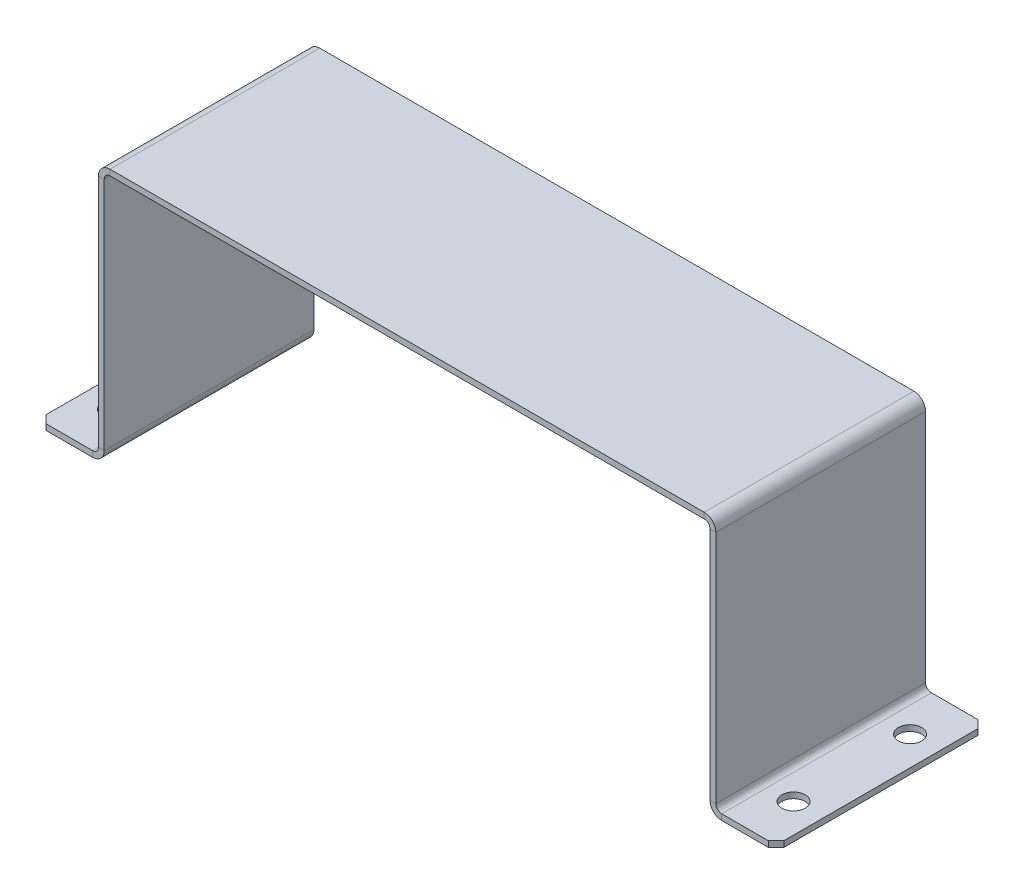
ISO-10303-21;
HEADER;
FILE_DESCRIPTION(('STEP AP214'),'2;1');
FILE_NAME('part.step','',(''),(''),'','','');
FILE_SCHEMA(('AUTOMOTIVE_DESIGN { 1 0 10303 214 1 1 1 1 }'));
ENDSEC;
DATA;
#1=APPLICATION_CONTEXT('core data for automotive mechanical design processes');
#2=APPLICATION_PROTOCOL_DEFINITION('international standard','automotive_design',2000,#1);
#3=PRODUCT_CONTEXT('',#1,'mechanical');
#4=PRODUCT('Part','Part','',(#3));
#5=PRODUCT_RELATED_PRODUCT_CATEGORY('part','',(#4));
#6=PRODUCT_DEFINITION_FORMATION('','',#4);
#7=PRODUCT_DEFINITION_CONTEXT('part definition',#1,'design');
#8=PRODUCT_DEFINITION('design','',#6,#7);
#9=PRODUCT_DEFINITION_SHAPE('','',#8);
#10=(LENGTH_UNIT() NAMED_UNIT(*) SI_UNIT(.MILLI.,.METRE.));
#11=(NAMED_UNIT(*) PLANE_ANGLE_UNIT() SI_UNIT($,.RADIAN.));
#12=(NAMED_UNIT(*) SI_UNIT($,.STERADIAN.) SOLID_ANGLE_UNIT());
#13=UNCERTAINTY_MEASURE_WITH_UNIT(LENGTH_MEASURE(1.E-05),#10,'distance_accuracy_value','');
#14=(GEOMETRIC_REPRESENTATION_CONTEXT(3) GLOBAL_UNCERTAINTY_ASSIGNED_CONTEXT((#13)) GLOBAL_UNIT_ASSIGNED_CONTEXT((#10,
#11,#12)) REPRESENTATION_CONTEXT('',''));
#15=CARTESIAN_POINT('',(0.,0.,0.));
#16=DIRECTION('',(0.,0.,1.));
#17=DIRECTION('',(1.,0.,0.));
#18=AXIS2_PLACEMENT_3D('',#15,#16,#17);
#19=CARTESIAN_POINT('',(-81.,-32.5,27.));
#20=DIRECTION('',(0.,0.,1.));
#21=DIRECTION('',(1.,0.,0.));
#22=AXIS2_PLACEMENT_3D('',#19,#20,#21);
#23=PLANE('',#22);
#24=DIRECTION('',(0.,1.,0.));
#25=VECTOR('',#24,1.);
#26=CARTESIAN_POINT('',(-81.,-32.5,27.));
#27=LINE('',#26,#25);
#28=CARTESIAN_POINT('',(-81.,-32.5,27.));
#29=VERTEX_POINT('',#28);
#30=CARTESIAN_POINT('',(-81.,-31.,27.));
#31=VERTEX_POINT('',#30);
#32=EDGE_CURVE('E200',#29,#31,#27,.T.);
#33=ORIENTED_EDGE('',*,*,#32,.F.);
#34=CARTESIAN_POINT('',(-81.,-29.5,27.));
#35=DIRECTION('',(0.,0.,-1.));
#36=DIRECTION('',(-1.,0.,0.));
#37=AXIS2_PLACEMENT_3D('',#34,#35,#36);
#38=CIRCLE('',#37,3.);
#39=CARTESIAN_POINT('',(-78.,-29.5,27.));
#40=VERTEX_POINT('',#39);
#41=EDGE_CURVE('E203',#40,#29,#38,.T.);
#42=ORIENTED_EDGE('',*,*,#41,.F.);
#43=DIRECTION('',(1.,0.,0.));
#44=VECTOR('',#43,1.);
#45=CARTESIAN_POINT('',(-79.5,-29.5,27.));
#46=LINE('',#45,#44);
#47=CARTESIAN_POINT('',(-79.5,-29.5,27.));
#48=VERTEX_POINT('',#47);
#49=EDGE_CURVE('E212',#48,#40,#46,.T.);
#50=ORIENTED_EDGE('',*,*,#49,.F.);
#51=CARTESIAN_POINT('',(-81.,-29.5,27.));
#52=DIRECTION('',(0.,0.,1.));
#53=DIRECTION('',(1.,0.,0.));
#54=AXIS2_PLACEMENT_3D('',#51,#52,#53);
#55=CIRCLE('',#54,1.5);
#56=EDGE_CURVE('E206',#48,#31,#55,.F.);
#57=ORIENTED_EDGE('',*,*,#56,.T.);
#58=EDGE_LOOP('',(#33,#42,#50,#57));
#59=FACE_BOUND('',#58,.T.);
#60=ADVANCED_FACE('F37',(#59),#23,.T.);
#61=CARTESIAN_POINT('',(-79.5,-29.5,27.));
#62=DIRECTION('',(0.,0.,1.));
#63=DIRECTION('',(1.,0.,0.));
#64=AXIS2_PLACEMENT_3D('',#61,#62,#63);
#65=PLANE('',#64);
#66=DIRECTION('',(1.,0.,0.));
#67=VECTOR('',#66,1.);
#68=CARTESIAN_POINT('',(-78.,-31.,27.));
#69=LINE('',#68,#67);
#70=CARTESIAN_POINT('',(-93.,-31.,27.));
#71=VERTEX_POINT('',#70);
#72=EDGE_CURVE('E233',#31,#71,#69,.F.);
#73=ORIENTED_EDGE('',*,*,#72,.T.);
#74=DIRECTION('',(0.,-1.,0.));
#75=VECTOR('',#74,1.);
#76=CARTESIAN_POINT('',(-93.,-29.5,27.));
#77=LINE('',#76,#75);
#78=CARTESIAN_POINT('',(-93.,-32.5,27.));
#79=VERTEX_POINT('',#78);
#80=EDGE_CURVE('E232',#71,#79,#77,.T.);
#81=ORIENTED_EDGE('',*,*,#80,.T.);
#82=DIRECTION('',(-1.,0.,0.));
#83=VECTOR('',#82,1.);
#84=CARTESIAN_POINT('',(-78.,-32.5,27.));
#85=LINE('',#84,#83);
#86=EDGE_CURVE('E220',#29,#79,#85,.T.);
#87=ORIENTED_EDGE('',*,*,#86,.F.);
#88=ORIENTED_EDGE('',*,*,#32,.T.);
#89=EDGE_LOOP('',(#73,#81,#87,#88));
#90=FACE_BOUND('',#89,.T.);
#91=ADVANCED_FACE('F230',(#90),#65,.T.);
#92=CARTESIAN_POINT('',(-78.,-29.5,-27.));
#93=DIRECTION('',(0.,0.,-1.));
#94=DIRECTION('',(-1.,0.,0.));
#95=AXIS2_PLACEMENT_3D('',#92,#93,#94);
#96=PLANE('',#95);
#97=DIRECTION('',(-1.,0.,0.));
#98=VECTOR('',#97,1.);
#99=CARTESIAN_POINT('',(-78.,-29.5,-27.));
#100=LINE('',#99,#98);
#101=CARTESIAN_POINT('',(-78.,-29.5,-27.));
#102=VERTEX_POINT('',#101);
#103=CARTESIAN_POINT('',(-79.5,-29.5,-27.));
#104=VERTEX_POINT('',#103);
#105=EDGE_CURVE('E412',#102,#104,#100,.T.);
#106=ORIENTED_EDGE('',*,*,#105,.F.);
#107=CARTESIAN_POINT('',(-81.,-29.5,-27.));
#108=DIRECTION('',(0.,0.,-1.));
#109=DIRECTION('',(-1.,0.,0.));
#110=AXIS2_PLACEMENT_3D('',#107,#108,#109);
#111=CIRCLE('',#110,3.);
#112=CARTESIAN_POINT('',(-81.,-32.5,-27.));
#113=VERTEX_POINT('',#112);
#114=EDGE_CURVE('E287',#102,#113,#111,.T.);
#115=ORIENTED_EDGE('',*,*,#114,.T.);
#116=DIRECTION('',(0.,-1.,0.));
#117=VECTOR('',#116,1.);
#118=CARTESIAN_POINT('',(-81.,-31.,-27.));
#119=LINE('',#118,#117);
#120=CARTESIAN_POINT('',(-81.,-31.,-27.));
#121=VERTEX_POINT('',#120);
#122=EDGE_CURVE('E410',#121,#113,#119,.T.);
#123=ORIENTED_EDGE('',*,*,#122,.F.);
#124=CARTESIAN_POINT('',(-81.,-29.5,-27.));
#125=DIRECTION('',(0.,0.,1.));
#126=DIRECTION('',(1.,0.,0.));
#127=AXIS2_PLACEMENT_3D('',#124,#125,#126);
#128=CIRCLE('',#127,1.5);
#129=EDGE_CURVE('E329',#104,#121,#128,.F.);
#130=ORIENTED_EDGE('',*,*,#129,.F.);
#131=EDGE_LOOP('',(#106,#115,#123,#130));
#132=FACE_BOUND('',#131,.T.);
#133=ADVANCED_FACE('F577',(#132),#96,.T.);
#134=CARTESIAN_POINT('',(-81.,-31.,-27.));
#135=DIRECTION('',(0.,0.,-1.));
#136=DIRECTION('',(-1.,0.,0.));
#137=AXIS2_PLACEMENT_3D('',#134,#135,#136);
#138=PLANE('',#137);
#139=DIRECTION('',(0.,-1.,0.));
#140=VECTOR('',#139,1.);
#141=CARTESIAN_POINT('',(-78.,-32.5,-27.));
#142=LINE('',#141,#140);
#143=CARTESIAN_POINT('',(-78.,31.,-27.));
#144=VERTEX_POINT('',#143);
#145=EDGE_CURVE('E289',#144,#102,#142,.T.);
#146=ORIENTED_EDGE('',*,*,#145,.T.);
#147=ORIENTED_EDGE('',*,*,#105,.T.);
#148=DIRECTION('',(0.,1.,0.));
#149=VECTOR('',#148,1.);
#150=CARTESIAN_POINT('',(-79.5,-32.5,-27.));
#151=LINE('',#150,#149);
#152=CARTESIAN_POINT('',(-79.5,31.,-27.));
#153=VERTEX_POINT('',#152);
#154=EDGE_CURVE('E326',#153,#104,#151,.F.);
#155=ORIENTED_EDGE('',*,*,#154,.F.);
#156=DIRECTION('',(1.,0.,0.));
#157=VECTOR('',#156,1.);
#158=CARTESIAN_POINT('',(-79.5,31.,-27.));
#159=LINE('',#158,#157);
#160=EDGE_CURVE('E402',#153,#144,#159,.T.);
#161=ORIENTED_EDGE('',*,*,#160,.T.);
#162=EDGE_LOOP('',(#146,#147,#155,#161));
#163=FACE_BOUND('',#162,.T.);
#164=ADVANCED_FACE('F614',(#163),#138,.T.);
#165=CARTESIAN_POINT('',(-78.,31.,27.));
#166=DIRECTION('',(0.,0.,1.));
#167=DIRECTION('',(1.,0.,0.));
#168=AXIS2_PLACEMENT_3D('',#165,#166,#167);
#169=PLANE('',#168);
#170=DIRECTION('',(-1.,0.,0.));
#171=VECTOR('',#170,1.);
#172=CARTESIAN_POINT('',(-78.,31.,27.));
#173=LINE('',#172,#171);
#174=CARTESIAN_POINT('',(-78.,31.,27.));
#175=VERTEX_POINT('',#174);
#176=CARTESIAN_POINT('',(-79.5,31.,27.));
#177=VERTEX_POINT('',#176);
#178=EDGE_CURVE('E408',#175,#177,#173,.T.);
#179=ORIENTED_EDGE('',*,*,#178,.F.);
#180=CARTESIAN_POINT('',(-76.5,31.,27.));
#181=DIRECTION('',(0.,0.,1.));
#182=DIRECTION('',(1.,0.,0.));
#183=AXIS2_PLACEMENT_3D('',#180,#181,#182);
#184=CIRCLE('',#183,1.5);
#185=CARTESIAN_POINT('',(-76.5,32.5,27.));
#186=VERTEX_POINT('',#185);
#187=EDGE_CURVE('E240',#186,#175,#184,.T.);
#188=ORIENTED_EDGE('',*,*,#187,.F.);
#189=DIRECTION('',(0.,-1.,0.));
#190=VECTOR('',#189,1.);
#191=CARTESIAN_POINT('',(-76.5,34.,27.));
#192=LINE('',#191,#190);
#193=CARTESIAN_POINT('',(-76.5,34.,27.));
#194=VERTEX_POINT('',#193);
#195=EDGE_CURVE('E406',#194,#186,#192,.T.);
#196=ORIENTED_EDGE('',*,*,#195,.F.);
#197=CARTESIAN_POINT('',(-76.5,31.,27.));
#198=DIRECTION('',(0.,0.,1.));
#199=DIRECTION('',(1.,0.,0.));
#200=AXIS2_PLACEMENT_3D('',#197,#198,#199);
#201=CIRCLE('',#200,3.);
#202=EDGE_CURVE('E274',#194,#177,#201,.T.);
#203=ORIENTED_EDGE('',*,*,#202,.T.);
#204=EDGE_LOOP('',(#179,#188,#196,#203));
#205=FACE_BOUND('',#204,.T.);
#206=ADVANCED_FACE('F507',(#205),#169,.T.);
#207=CARTESIAN_POINT('',(-76.5,34.,27.));
#208=DIRECTION('',(0.,0.,1.));
#209=DIRECTION('',(1.,0.,0.));
#210=AXIS2_PLACEMENT_3D('',#207,#208,#209);
#211=PLANE('',#210);
#212=DIRECTION('',(0.,-1.,0.));
#213=VECTOR('',#212,1.);
#214=CARTESIAN_POINT('',(-78.,-32.5,27.));
#215=LINE('',#214,#213);
#216=EDGE_CURVE('E238',#175,#40,#215,.T.);
#217=ORIENTED_EDGE('',*,*,#216,.F.);
#218=ORIENTED_EDGE('',*,*,#178,.T.);
#219=DIRECTION('',(0.,1.,0.));
#220=VECTOR('',#219,1.);
#221=CARTESIAN_POINT('',(-79.5,-32.5,27.));
#222=LINE('',#221,#220);
#223=EDGE_CURVE('E277',#177,#48,#222,.F.);
#224=ORIENTED_EDGE('',*,*,#223,.T.);
#225=ORIENTED_EDGE('',*,*,#49,.T.);
#226=EDGE_LOOP('',(#217,#218,#224,#225));
#227=FACE_BOUND('',#226,.T.);
#228=ADVANCED_FACE('F516',(#227),#211,.T.);
#229=CARTESIAN_POINT('',(-76.5,32.5,-27.));
#230=DIRECTION('',(0.,0.,-1.));
#231=DIRECTION('',(-1.,0.,0.));
#232=AXIS2_PLACEMENT_3D('',#229,#230,#231);
#233=PLANE('',#232);
#234=DIRECTION('',(0.,1.,0.));
#235=VECTOR('',#234,1.);
#236=CARTESIAN_POINT('',(-76.5,32.5,-27.));
#237=LINE('',#236,#235);
#238=CARTESIAN_POINT('',(-76.5,32.5,-27.));
#239=VERTEX_POINT('',#238);
#240=CARTESIAN_POINT('',(-76.5,34.,-27.));
#241=VERTEX_POINT('',#240);
#242=EDGE_CURVE('E404',#239,#241,#237,.T.);
#243=ORIENTED_EDGE('',*,*,#242,.F.);
#244=CARTESIAN_POINT('',(-76.5,31.,-27.));
#245=DIRECTION('',(0.,0.,1.));
#246=DIRECTION('',(1.,0.,0.));
#247=AXIS2_PLACEMENT_3D('',#244,#245,#246);
#248=CIRCLE('',#247,1.5);
#249=EDGE_CURVE('E292',#239,#144,#248,.T.);
#250=ORIENTED_EDGE('',*,*,#249,.T.);
#251=ORIENTED_EDGE('',*,*,#160,.F.);
#252=CARTESIAN_POINT('',(-76.5,31.,-27.));
#253=DIRECTION('',(0.,0.,1.));
#254=DIRECTION('',(1.,0.,0.));
#255=AXIS2_PLACEMENT_3D('',#252,#253,#254);
#256=CIRCLE('',#255,3.);
#257=EDGE_CURVE('E323',#241,#153,#256,.T.);
#258=ORIENTED_EDGE('',*,*,#257,.F.);
#259=EDGE_LOOP('',(#243,#250,#251,#258));
#260=FACE_BOUND('',#259,.T.);
#261=ADVANCED_FACE('F656',(#260),#233,.T.);
#262=CARTESIAN_POINT('',(-79.5,31.,-27.));
#263=DIRECTION('',(0.,0.,-1.));
#264=DIRECTION('',(-1.,0.,0.));
#265=AXIS2_PLACEMENT_3D('',#262,#263,#264);
#266=PLANE('',#265);
#267=DIRECTION('',(-1.,0.,0.));
#268=VECTOR('',#267,1.);
#269=CARTESIAN_POINT('',(-78.,32.5,-27.));
#270=LINE('',#269,#268);
#271=CARTESIAN_POINT('',(76.5,32.5,-27.));
#272=VERTEX_POINT('',#271);
#273=EDGE_CURVE('E295',#272,#239,#270,.T.);
#274=ORIENTED_EDGE('',*,*,#273,.T.);
#275=ORIENTED_EDGE('',*,*,#242,.T.);
#276=DIRECTION('',(1.,0.,0.));
#277=VECTOR('',#276,1.);
#278=CARTESIAN_POINT('',(-78.,34.,-27.));
#279=LINE('',#278,#277);
#280=CARTESIAN_POINT('',(76.5,34.,-27.));
#281=VERTEX_POINT('',#280);
#282=EDGE_CURVE('E320',#281,#241,#279,.F.);
#283=ORIENTED_EDGE('',*,*,#282,.F.);
#284=DIRECTION('',(0.,-1.,0.));
#285=VECTOR('',#284,1.);
#286=CARTESIAN_POINT('',(76.5,34.,-27.));
#287=LINE('',#286,#285);
#288=EDGE_CURVE('E394',#281,#272,#287,.T.);
#289=ORIENTED_EDGE('',*,*,#288,.T.);
#290=EDGE_LOOP('',(#274,#275,#283,#289));
#291=FACE_BOUND('',#290,.T.);
#292=ADVANCED_FACE('F653',(#291),#266,.T.);
#293=CARTESIAN_POINT('',(76.5,32.5,27.));
#294=DIRECTION('',(0.,0.,1.));
#295=DIRECTION('',(1.,0.,0.));
#296=AXIS2_PLACEMENT_3D('',#293,#294,#295);
#297=PLANE('',#296);
#298=DIRECTION('',(0.,1.,0.));
#299=VECTOR('',#298,1.);
#300=CARTESIAN_POINT('',(76.5,32.5,27.));
#301=LINE('',#300,#299);
#302=CARTESIAN_POINT('',(76.5,32.5,27.));
#303=VERTEX_POINT('',#302);
#304=CARTESIAN_POINT('',(76.5,34.,27.));
#305=VERTEX_POINT('',#304);
#306=EDGE_CURVE('E400',#303,#305,#301,.T.);
#307=ORIENTED_EDGE('',*,*,#306,.F.);
#308=CARTESIAN_POINT('',(76.5,31.,27.));
#309=DIRECTION('',(0.,0.,1.));
#310=DIRECTION('',(1.,0.,0.));
#311=AXIS2_PLACEMENT_3D('',#308,#309,#310);
#312=CIRCLE('',#311,1.5);
#313=CARTESIAN_POINT('',(78.,31.,27.));
#314=VERTEX_POINT('',#313);
#315=EDGE_CURVE('E249',#314,#303,#312,.T.);
#316=ORIENTED_EDGE('',*,*,#315,.F.);
#317=DIRECTION('',(-1.,0.,0.));
#318=VECTOR('',#317,1.);
#319=CARTESIAN_POINT('',(79.5,31.,27.));
#320=LINE('',#319,#318);
#321=CARTESIAN_POINT('',(79.5,31.,27.));
#322=VERTEX_POINT('',#321);
#323=EDGE_CURVE('E398',#322,#314,#320,.T.);
#324=ORIENTED_EDGE('',*,*,#323,.F.);
#325=CARTESIAN_POINT('',(76.5,31.,27.));
#326=DIRECTION('',(0.,0.,1.));
#327=DIRECTION('',(1.,0.,0.));
#328=AXIS2_PLACEMENT_3D('',#325,#326,#327);
#329=CIRCLE('',#328,3.);
#330=EDGE_CURVE('E268',#322,#305,#329,.T.);
#331=ORIENTED_EDGE('',*,*,#330,.T.);
#332=EDGE_LOOP('',(#307,#316,#324,#331));
#333=FACE_BOUND('',#332,.T.);
#334=ADVANCED_FACE('F489',(#333),#297,.T.);
#335=CARTESIAN_POINT('',(79.5,31.,27.));
#336=DIRECTION('',(0.,0.,1.));
#337=DIRECTION('',(1.,0.,0.));
#338=AXIS2_PLACEMENT_3D('',#335,#336,#337);
#339=PLANE('',#338);
#340=DIRECTION('',(-1.,0.,0.));
#341=VECTOR('',#340,1.);
#342=CARTESIAN_POINT('',(-78.,32.5,27.));
#343=LINE('',#342,#341);
#344=EDGE_CURVE('E246',#303,#186,#343,.T.);
#345=ORIENTED_EDGE('',*,*,#344,.F.);
#346=ORIENTED_EDGE('',*,*,#306,.T.);
#347=DIRECTION('',(1.,0.,0.));
#348=VECTOR('',#347,1.);
#349=CARTESIAN_POINT('',(-78.,34.,27.));
#350=LINE('',#349,#348);
#351=EDGE_CURVE('E271',#305,#194,#350,.F.);
#352=ORIENTED_EDGE('',*,*,#351,.T.);
#353=ORIENTED_EDGE('',*,*,#195,.T.);
#354=EDGE_LOOP('',(#345,#346,#352,#353));
#355=FACE_BOUND('',#354,.T.);
#356=ADVANCED_FACE('F498',(#355),#339,.T.);
#357=CARTESIAN_POINT('',(78.,31.,-27.));
#358=DIRECTION('',(0.,0.,-1.));
#359=DIRECTION('',(-1.,0.,0.));
#360=AXIS2_PLACEMENT_3D('',#357,#358,#359);
#361=PLANE('',#360);
#362=DIRECTION('',(1.,0.,0.));
#363=VECTOR('',#362,1.);
#364=CARTESIAN_POINT('',(78.,31.,-27.));
#365=LINE('',#364,#363);
#366=CARTESIAN_POINT('',(78.,31.,-27.));
#367=VERTEX_POINT('',#366);
#368=CARTESIAN_POINT('',(79.5,31.,-27.));
#369=VERTEX_POINT('',#368);
#370=EDGE_CURVE('E396',#367,#369,#365,.T.);
#371=ORIENTED_EDGE('',*,*,#370,.F.);
#372=CARTESIAN_POINT('',(76.5,31.,-27.));
#373=DIRECTION('',(0.,0.,1.));
#374=DIRECTION('',(1.,0.,0.));
#375=AXIS2_PLACEMENT_3D('',#372,#373,#374);
#376=CIRCLE('',#375,1.5);
#377=EDGE_CURVE('E298',#367,#272,#376,.T.);
#378=ORIENTED_EDGE('',*,*,#377,.T.);
#379=ORIENTED_EDGE('',*,*,#288,.F.);
#380=CARTESIAN_POINT('',(76.5,31.,-27.));
#381=DIRECTION('',(0.,0.,1.));
#382=DIRECTION('',(1.,0.,0.));
#383=AXIS2_PLACEMENT_3D('',#380,#381,#382);
#384=CIRCLE('',#383,3.);
#385=EDGE_CURVE('E317',#369,#281,#384,.T.);
#386=ORIENTED_EDGE('',*,*,#385,.F.);
#387=EDGE_LOOP('',(#371,#378,#379,#386));
#388=FACE_BOUND('',#387,.T.);
#389=ADVANCED_FACE('F644',(#388),#361,.T.);
#390=CARTESIAN_POINT('',(76.5,34.,-27.));
#391=DIRECTION('',(0.,0.,-1.));
#392=DIRECTION('',(-1.,0.,0.));
#393=AXIS2_PLACEMENT_3D('',#390,#391,#392);
#394=PLANE('',#393);
#395=DIRECTION('',(0.,1.,0.));
#396=VECTOR('',#395,1.);
#397=CARTESIAN_POINT('',(78.,-32.5,-27.));
#398=LINE('',#397,#396);
#399=CARTESIAN_POINT('',(78.,-29.5,-27.));
#400=VERTEX_POINT('',#399);
#401=EDGE_CURVE('E301',#400,#367,#398,.T.);
#402=ORIENTED_EDGE('',*,*,#401,.T.);
#403=ORIENTED_EDGE('',*,*,#370,.T.);
#404=DIRECTION('',(0.,1.,0.));
#405=VECTOR('',#404,1.);
#406=CARTESIAN_POINT('',(79.5,-32.5,-27.));
#407=LINE('',#406,#405);
#408=CARTESIAN_POINT('',(79.5,-29.5,-27.));
#409=VERTEX_POINT('',#408);
#410=EDGE_CURVE('E314',#409,#369,#407,.T.);
#411=ORIENTED_EDGE('',*,*,#410,.F.);
#412=DIRECTION('',(-1.,0.,0.));
#413=VECTOR('',#412,1.);
#414=CARTESIAN_POINT('',(79.5,-29.5,-27.));
#415=LINE('',#414,#413);
#416=EDGE_CURVE('E384',#409,#400,#415,.T.);
#417=ORIENTED_EDGE('',*,*,#416,.T.);
#418=EDGE_LOOP('',(#402,#403,#411,#417));
#419=FACE_BOUND('',#418,.T.);
#420=ADVANCED_FACE('F641',(#419),#394,.T.);
#421=CARTESIAN_POINT('',(78.,-29.5,27.));
#422=DIRECTION('',(0.,0.,1.));
#423=DIRECTION('',(1.,0.,0.));
#424=AXIS2_PLACEMENT_3D('',#421,#422,#423);
#425=PLANE('',#424);
#426=DIRECTION('',(1.,0.,0.));
#427=VECTOR('',#426,1.);
#428=CARTESIAN_POINT('',(78.,-29.5,27.));
#429=LINE('',#428,#427);
#430=CARTESIAN_POINT('',(78.,-29.5,27.));
#431=VERTEX_POINT('',#430);
#432=CARTESIAN_POINT('',(79.5,-29.5,27.));
#433=VERTEX_POINT('',#432);
#434=EDGE_CURVE('E392',#431,#433,#429,.T.);
#435=ORIENTED_EDGE('',*,*,#434,.F.);
#436=CARTESIAN_POINT('',(81.,-29.5,27.));
#437=DIRECTION('',(0.,0.,-1.));
#438=DIRECTION('',(-1.,0.,0.));
#439=AXIS2_PLACEMENT_3D('',#436,#437,#438);
#440=CIRCLE('',#439,3.);
#441=CARTESIAN_POINT('',(81.,-32.5,27.));
#442=VERTEX_POINT('',#441);
#443=EDGE_CURVE('E255',#442,#431,#440,.T.);
#444=ORIENTED_EDGE('',*,*,#443,.F.);
#445=DIRECTION('',(0.,-1.,0.));
#446=VECTOR('',#445,1.);
#447=CARTESIAN_POINT('',(81.,-31.,27.));
#448=LINE('',#447,#446);
#449=CARTESIAN_POINT('',(81.,-31.,27.));
#450=VERTEX_POINT('',#449);
#451=EDGE_CURVE('E389',#450,#442,#448,.T.);
#452=ORIENTED_EDGE('',*,*,#451,.F.);
#453=CARTESIAN_POINT('',(81.,-29.5,27.));
#454=DIRECTION('',(0.,0.,1.));
#455=DIRECTION('',(1.,0.,0.));
#456=AXIS2_PLACEMENT_3D('',#453,#454,#455);
#457=CIRCLE('',#456,1.5);
#458=EDGE_CURVE('E262',#450,#433,#457,.F.);
#459=ORIENTED_EDGE('',*,*,#458,.T.);
#460=EDGE_LOOP('',(#435,#444,#452,#459));
#461=FACE_BOUND('',#460,.T.);
#462=ADVANCED_FACE('F471',(#461),#425,.T.);
#463=CARTESIAN_POINT('',(81.,-31.,27.));
#464=DIRECTION('',(0.,0.,1.));
#465=DIRECTION('',(1.,0.,0.));
#466=AXIS2_PLACEMENT_3D('',#463,#464,#465);
#467=PLANE('',#466);
#468=DIRECTION('',(0.,1.,0.));
#469=VECTOR('',#468,1.);
#470=CARTESIAN_POINT('',(78.,-32.5,27.));
#471=LINE('',#470,#469);
#472=EDGE_CURVE('E252',#431,#314,#471,.T.);
#473=ORIENTED_EDGE('',*,*,#472,.F.);
#474=ORIENTED_EDGE('',*,*,#434,.T.);
#475=DIRECTION('',(0.,1.,0.));
#476=VECTOR('',#475,1.);
#477=CARTESIAN_POINT('',(79.5,-32.5,27.));
#478=LINE('',#477,#476);
#479=EDGE_CURVE('E265',#433,#322,#478,.T.);
#480=ORIENTED_EDGE('',*,*,#479,.T.);
#481=ORIENTED_EDGE('',*,*,#323,.T.);
#482=EDGE_LOOP('',(#473,#474,#480,#481));
#483=FACE_BOUND('',#482,.T.);
#484=ADVANCED_FACE('F480',(#483),#467,.T.);
#485=CARTESIAN_POINT('',(81.,-32.5,-27.));
#486=DIRECTION('',(0.,0.,-1.));
#487=DIRECTION('',(-1.,0.,0.));
#488=AXIS2_PLACEMENT_3D('',#485,#486,#487);
#489=PLANE('',#488);
#490=DIRECTION('',(0.,1.,0.));
#491=VECTOR('',#490,1.);
#492=CARTESIAN_POINT('',(81.,-32.5,-27.));
#493=LINE('',#492,#491);
#494=CARTESIAN_POINT('',(81.,-32.5,-27.));
#495=VERTEX_POINT('',#494);
#496=CARTESIAN_POINT('',(81.,-31.,-27.));
#497=VERTEX_POINT('',#496);
#498=EDGE_CURVE('E386',#495,#497,#493,.T.);
#499=ORIENTED_EDGE('',*,*,#498,.F.);
#500=CARTESIAN_POINT('',(81.,-29.5,-27.));
#501=DIRECTION('',(0.,0.,-1.));
#502=DIRECTION('',(-1.,0.,0.));
#503=AXIS2_PLACEMENT_3D('',#500,#501,#502);
#504=CIRCLE('',#503,3.);
#505=EDGE_CURVE('E304',#495,#400,#504,.T.);
#506=ORIENTED_EDGE('',*,*,#505,.T.);
#507=ORIENTED_EDGE('',*,*,#416,.F.);
#508=CARTESIAN_POINT('',(81.,-29.5,-27.));
#509=DIRECTION('',(0.,0.,1.));
#510=DIRECTION('',(1.,0.,0.));
#511=AXIS2_PLACEMENT_3D('',#508,#509,#510);
#512=CIRCLE('',#511,1.5);
#513=EDGE_CURVE('E311',#497,#409,#512,.F.);
#514=ORIENTED_EDGE('',*,*,#513,.F.);
#515=EDGE_LOOP('',(#499,#506,#507,#514));
#516=FACE_BOUND('',#515,.T.);
#517=ADVANCED_FACE('F633',(#516),#489,.T.);
#518=CARTESIAN_POINT('',(79.5,-29.5,-27.));
#519=DIRECTION('',(0.,0.,-1.));
#520=DIRECTION('',(-1.,0.,0.));
#521=AXIS2_PLACEMENT_3D('',#518,#519,#520);
#522=PLANE('',#521);
#523=DIRECTION('',(1.,0.,0.));
#524=VECTOR('',#523,1.);
#525=CARTESIAN_POINT('',(78.,-31.,-27.));
#526=LINE('',#525,#524);
#527=CARTESIAN_POINT('',(93.,-31.,-27.));
#528=VERTEX_POINT('',#527);
#529=EDGE_CURVE('E309',#528,#497,#526,.F.);
#530=ORIENTED_EDGE('',*,*,#529,.F.);
#531=DIRECTION('',(0.,-1.,0.));
#532=VECTOR('',#531,1.);
#533=CARTESIAN_POINT('',(93.,-29.5,-27.));
#534=LINE('',#533,#532);
#535=CARTESIAN_POINT('',(93.,-32.5,-27.));
#536=VERTEX_POINT('',#535);
#537=EDGE_CURVE('E11',#528,#536,#534,.T.);
#538=ORIENTED_EDGE('',*,*,#537,.T.);
#539=DIRECTION('',(-1.,0.,0.));
#540=VECTOR('',#539,1.);
#541=CARTESIAN_POINT('',(78.,-32.5,-27.));
#542=LINE('',#541,#540);
#543=EDGE_CURVE('E307',#536,#495,#542,.T.);
#544=ORIENTED_EDGE('',*,*,#543,.T.);
#545=ORIENTED_EDGE('',*,*,#498,.T.);
#546=EDGE_LOOP('',(#530,#538,#544,#545));
#547=FACE_BOUND('',#546,.T.);
#548=ADVANCED_FACE('F552',(#547),#522,.T.);
#549=CARTESIAN_POINT('',(-78.,-31.,27.));
#550=DIRECTION('',(0.,-1.,0.));
#551=DIRECTION('',(0.,0.,-1.));
#552=AXIS2_PLACEMENT_3D('',#549,#550,#551);
#553=PLANE('',#552);
#554=CARTESIAN_POINT('',(-87.5,-31.,-15.));
#555=DIRECTION('',(0.,1.,0.));
#556=DIRECTION('',(0.,0.,-1.));
#557=AXIS2_PLACEMENT_3D('',#554,#555,#556);
#558=CIRCLE('',#557,3.00000000000001);
#559=CARTESIAN_POINT('',(-87.5,-31.,-18.));
#560=VERTEX_POINT('',#559);
#561=EDGE_CURVE('E422',#560,#560,#558,.T.);
#562=ORIENTED_EDGE('',*,*,#561,.F.);
#563=EDGE_LOOP('',(#562));
#564=FACE_BOUND('',#563,.T.);
#565=CARTESIAN_POINT('',(-87.5,-31.,15.));
#566=DIRECTION('',(0.,1.,0.));
#567=DIRECTION('',(0.,0.,1.));
#568=AXIS2_PLACEMENT_3D('',#565,#566,#567);
#569=CIRCLE('',#568,3.00000000000001);
#570=CARTESIAN_POINT('',(-87.5,-31.,18.));
#571=VERTEX_POINT('',#570);
#572=EDGE_CURVE('E417',#571,#571,#569,.T.);
#573=ORIENTED_EDGE('',*,*,#572,.F.);
#574=EDGE_LOOP('',(#573));
#575=FACE_BOUND('',#574,.T.);
#576=DIRECTION('',(0.,0.,-1.));
#577=VECTOR('',#576,1.);
#578=CARTESIAN_POINT('',(-95.,-31.,27.));
#579=LINE('',#578,#577);
#580=CARTESIAN_POINT('',(-95.,-31.,25.));
#581=VERTEX_POINT('',#580);
#582=CARTESIAN_POINT('',(-95.,-31.,-25.));
#583=VERTEX_POINT('',#582);
#584=EDGE_CURVE('E381',#581,#583,#579,.T.);
#585=ORIENTED_EDGE('',*,*,#584,.F.);
#586=DIRECTION('',(-0.707106781186552,0.,-0.707106781186543));
#587=VECTOR('',#586,1.);
#588=CARTESIAN_POINT('',(-95.,-31.,25.));
#589=LINE('',#588,#587);
#590=EDGE_CURVE('E429',#581,#71,#589,.F.);
#591=ORIENTED_EDGE('',*,*,#590,.T.);
#592=ORIENTED_EDGE('',*,*,#72,.F.);
#593=DIRECTION('',(0.,0.,-1.));
#594=VECTOR('',#593,1.);
#595=CARTESIAN_POINT('',(-81.,-31.,27.));
#596=LINE('',#595,#594);
#597=EDGE_CURVE('E281',#31,#121,#596,.T.);
#598=ORIENTED_EDGE('',*,*,#597,.T.);
#599=DIRECTION('',(1.,0.,0.));
#600=VECTOR('',#599,1.);
#601=CARTESIAN_POINT('',(-78.,-31.,-27.));
#602=LINE('',#601,#600);
#603=CARTESIAN_POINT('',(-93.,-31.,-27.));
#604=VERTEX_POINT('',#603);
#605=EDGE_CURVE('E282',#121,#604,#602,.F.);
#606=ORIENTED_EDGE('',*,*,#605,.T.);
#607=DIRECTION('',(0.707106781186548,0.,-0.707106781186548));
#608=VECTOR('',#607,1.);
#609=CARTESIAN_POINT('',(-93.,-31.,-27.));
#610=LINE('',#609,#608);
#611=EDGE_CURVE('E427',#604,#583,#610,.F.);
#612=ORIENTED_EDGE('',*,*,#611,.T.);
#613=EDGE_LOOP('',(#585,#591,#592,#598,#606,#612));
#614=FACE_BOUND('',#613,.T.);
#615=ADVANCED_FACE('F529',(#564,#575,#614),#553,.F.);
#616=CARTESIAN_POINT('',(-95.,-32.5,27.));
#617=DIRECTION('',(-1.,0.,0.));
#618=DIRECTION('',(0.,0.,1.));
#619=AXIS2_PLACEMENT_3D('',#616,#617,#618);
#620=PLANE('',#619);
#621=DIRECTION('',(0.,0.,-1.));
#622=VECTOR('',#621,1.);
#623=CARTESIAN_POINT('',(-95.,-32.5,27.));
#624=LINE('',#623,#622);
#625=CARTESIAN_POINT('',(-95.,-32.5,25.));
#626=VERTEX_POINT('',#625);
#627=CARTESIAN_POINT('',(-95.,-32.5,-25.));
#628=VERTEX_POINT('',#627);
#629=EDGE_CURVE('E227',#626,#628,#624,.T.);
#630=ORIENTED_EDGE('',*,*,#629,.F.);
#631=DIRECTION('',(0.,1.,0.));
#632=VECTOR('',#631,1.);
#633=CARTESIAN_POINT('',(-95.,-32.5,25.));
#634=LINE('',#633,#632);
#635=EDGE_CURVE('E424',#626,#581,#634,.T.);
#636=ORIENTED_EDGE('',*,*,#635,.T.);
#637=ORIENTED_EDGE('',*,*,#584,.T.);
#638=DIRECTION('',(0.,-1.,0.));
#639=VECTOR('',#638,1.);
#640=CARTESIAN_POINT('',(-95.,-32.5,-25.));
#641=LINE('',#640,#639);
#642=EDGE_CURVE('E211',#583,#628,#641,.T.);
#643=ORIENTED_EDGE('',*,*,#642,.T.);
#644=EDGE_LOOP('',(#630,#636,#637,#643));
#645=FACE_BOUND('',#644,.T.);
#646=ADVANCED_FACE('F551',(#645),#620,.T.);
#647=CARTESIAN_POINT('',(-78.,-32.5,27.));
#648=DIRECTION('',(0.,-1.,0.));
#649=DIRECTION('',(0.,0.,-1.));
#650=AXIS2_PLACEMENT_3D('',#647,#648,#649);
#651=PLANE('',#650);
#652=CARTESIAN_POINT('',(-87.5,-32.5,-15.));
#653=DIRECTION('',(0.,-1.,0.));
#654=DIRECTION('',(0.,0.,-1.));
#655=AXIS2_PLACEMENT_3D('',#652,#653,#654);
#656=CIRCLE('',#655,3.00000000000001);
#657=CARTESIAN_POINT('',(-87.5,-32.5,-18.));
#658=VERTEX_POINT('',#657);
#659=EDGE_CURVE('E418',#658,#658,#656,.T.);
#660=ORIENTED_EDGE('',*,*,#659,.F.);
#661=EDGE_LOOP('',(#660));
#662=FACE_BOUND('',#661,.T.);
#663=CARTESIAN_POINT('',(-87.5,-32.5,15.));
#664=DIRECTION('',(0.,-1.,0.));
#665=DIRECTION('',(0.,0.,-1.));
#666=AXIS2_PLACEMENT_3D('',#663,#664,#665);
#667=CIRCLE('',#666,3.00000000000001);
#668=CARTESIAN_POINT('',(-87.5,-32.5,12.));
#669=VERTEX_POINT('',#668);
#670=EDGE_CURVE('E285',#669,#669,#667,.T.);
#671=ORIENTED_EDGE('',*,*,#670,.F.);
#672=EDGE_LOOP('',(#671));
#673=FACE_BOUND('',#672,.T.);
#674=ORIENTED_EDGE('',*,*,#86,.T.);
#675=DIRECTION('',(0.707106781186552,0.,0.707106781186543));
#676=VECTOR('',#675,1.);
#677=CARTESIAN_POINT('',(-85.4999999999999,-32.5,34.5));
#678=LINE('',#677,#676);
#679=EDGE_CURVE('E434',#79,#626,#678,.F.);
#680=ORIENTED_EDGE('',*,*,#679,.T.);
#681=ORIENTED_EDGE('',*,*,#629,.T.);
#682=DIRECTION('',(-0.707106781186548,0.,0.707106781186548));
#683=VECTOR('',#682,1.);
#684=CARTESIAN_POINT('',(-112.5,-32.5,-7.5));
#685=LINE('',#684,#683);
#686=CARTESIAN_POINT('',(-93.,-32.5,-27.));
#687=VERTEX_POINT('',#686);
#688=EDGE_CURVE('E432',#628,#687,#685,.F.);
#689=ORIENTED_EDGE('',*,*,#688,.T.);
#690=DIRECTION('',(-1.,0.,0.));
#691=VECTOR('',#690,1.);
#692=CARTESIAN_POINT('',(-78.,-32.5,-27.));
#693=LINE('',#692,#691);
#694=EDGE_CURVE('E223',#113,#687,#693,.T.);
#695=ORIENTED_EDGE('',*,*,#694,.F.);
#696=DIRECTION('',(0.,0.,-1.));
#697=VECTOR('',#696,1.);
#698=CARTESIAN_POINT('',(-81.,-32.5,27.));
#699=LINE('',#698,#697);
#700=EDGE_CURVE('E218',#29,#113,#699,.T.);
#701=ORIENTED_EDGE('',*,*,#700,.F.);
#702=EDGE_LOOP('',(#674,#680,#681,#689,#695,#701));
#703=FACE_BOUND('',#702,.T.);
#704=ADVANCED_FACE('F219',(#662,#673,#703),#651,.T.);
#705=CARTESIAN_POINT('',(-81.,-29.5,27.));
#706=DIRECTION('',(0.,0.,-1.));
#707=DIRECTION('',(-1.,0.,0.));
#708=AXIS2_PLACEMENT_3D('',#705,#706,#707);
#709=CYLINDRICAL_SURFACE('',#708,3.);
#710=ORIENTED_EDGE('',*,*,#114,.F.);
#711=DIRECTION('',(0.,0.,-1.));
#712=VECTOR('',#711,1.);
#713=CARTESIAN_POINT('',(-78.,-29.5,27.));
#714=LINE('',#713,#712);
#715=EDGE_CURVE('E228',#40,#102,#714,.T.);
#716=ORIENTED_EDGE('',*,*,#715,.F.);
#717=ORIENTED_EDGE('',*,*,#41,.T.);
#718=ORIENTED_EDGE('',*,*,#700,.T.);
#719=EDGE_LOOP('',(#710,#716,#717,#718));
#720=FACE_BOUND('',#719,.T.);
#721=ADVANCED_FACE('F236',(#720),#709,.T.);
#722=CARTESIAN_POINT('',(-78.,-32.5,27.));
#723=DIRECTION('',(1.,0.,0.));
#724=DIRECTION('',(0.,0.,-1.));
#725=AXIS2_PLACEMENT_3D('',#722,#723,#724);
#726=PLANE('',#725);
#727=ORIENTED_EDGE('',*,*,#145,.F.);
#728=DIRECTION('',(0.,0.,-1.));
#729=VECTOR('',#728,1.);
#730=CARTESIAN_POINT('',(-78.,31.,27.));
#731=LINE('',#730,#729);
#732=EDGE_CURVE('E375',#175,#144,#731,.T.);
#733=ORIENTED_EDGE('',*,*,#732,.F.);
#734=ORIENTED_EDGE('',*,*,#216,.T.);
#735=ORIENTED_EDGE('',*,*,#715,.T.);
#736=EDGE_LOOP('',(#727,#733,#734,#735));
#737=FACE_BOUND('',#736,.T.);
#738=ADVANCED_FACE('F515',(#737),#726,.T.);
#739=CARTESIAN_POINT('',(-76.5,31.,27.));
#740=DIRECTION('',(0.,0.,-1.));
#741=DIRECTION('',(-1.,0.,0.));
#742=AXIS2_PLACEMENT_3D('',#739,#740,#741);
#743=CYLINDRICAL_SURFACE('',#742,1.5);
#744=ORIENTED_EDGE('',*,*,#249,.F.);
#745=DIRECTION('',(0.,0.,-1.));
#746=VECTOR('',#745,1.);
#747=CARTESIAN_POINT('',(-76.5,32.5,27.));
#748=LINE('',#747,#746);
#749=EDGE_CURVE('E372',#186,#239,#748,.T.);
#750=ORIENTED_EDGE('',*,*,#749,.F.);
#751=ORIENTED_EDGE('',*,*,#187,.T.);
#752=ORIENTED_EDGE('',*,*,#732,.T.);
#753=EDGE_LOOP('',(#744,#750,#751,#752));
#754=FACE_BOUND('',#753,.T.);
#755=ADVANCED_FACE('F506',(#754),#743,.F.);
#756=CARTESIAN_POINT('',(-78.,32.5,27.));
#757=DIRECTION('',(0.,-1.,0.));
#758=DIRECTION('',(0.,0.,-1.));
#759=AXIS2_PLACEMENT_3D('',#756,#757,#758);
#760=PLANE('',#759);
#761=ORIENTED_EDGE('',*,*,#273,.F.);
#762=DIRECTION('',(0.,0.,-1.));
#763=VECTOR('',#762,1.);
#764=CARTESIAN_POINT('',(76.5,32.5,27.));
#765=LINE('',#764,#763);
#766=EDGE_CURVE('E369',#303,#272,#765,.T.);
#767=ORIENTED_EDGE('',*,*,#766,.F.);
#768=ORIENTED_EDGE('',*,*,#344,.T.);
#769=ORIENTED_EDGE('',*,*,#749,.T.);
#770=EDGE_LOOP('',(#761,#767,#768,#769));
#771=FACE_BOUND('',#770,.T.);
#772=ADVANCED_FACE('F497',(#771),#760,.T.);
#773=CARTESIAN_POINT('',(76.5,31.,27.));
#774=DIRECTION('',(0.,0.,-1.));
#775=DIRECTION('',(-1.,0.,0.));
#776=AXIS2_PLACEMENT_3D('',#773,#774,#775);
#777=CYLINDRICAL_SURFACE('',#776,1.5);
#778=ORIENTED_EDGE('',*,*,#377,.F.);
#779=DIRECTION('',(0.,0.,-1.));
#780=VECTOR('',#779,1.);
#781=CARTESIAN_POINT('',(78.,31.,27.));
#782=LINE('',#781,#780);
#783=EDGE_CURVE('E366',#314,#367,#782,.T.);
#784=ORIENTED_EDGE('',*,*,#783,.F.);
#785=ORIENTED_EDGE('',*,*,#315,.T.);
#786=ORIENTED_EDGE('',*,*,#766,.T.);
#787=EDGE_LOOP('',(#778,#784,#785,#786));
#788=FACE_BOUND('',#787,.T.);
#789=ADVANCED_FACE('F488',(#788),#777,.F.);
#790=CARTESIAN_POINT('',(78.,-32.5,27.));
#791=DIRECTION('',(-1.,0.,0.));
#792=DIRECTION('',(0.,0.,1.));
#793=AXIS2_PLACEMENT_3D('',#790,#791,#792);
#794=PLANE('',#793);
#795=ORIENTED_EDGE('',*,*,#401,.F.);
#796=DIRECTION('',(0.,0.,-1.));
#797=VECTOR('',#796,1.);
#798=CARTESIAN_POINT('',(78.,-29.5,27.));
#799=LINE('',#798,#797);
#800=EDGE_CURVE('E363',#431,#400,#799,.T.);
#801=ORIENTED_EDGE('',*,*,#800,.F.);
#802=ORIENTED_EDGE('',*,*,#472,.T.);
#803=ORIENTED_EDGE('',*,*,#783,.T.);
#804=EDGE_LOOP('',(#795,#801,#802,#803));
#805=FACE_BOUND('',#804,.T.);
#806=ADVANCED_FACE('F479',(#805),#794,.T.);
#807=CARTESIAN_POINT('',(81.,-29.5,27.));
#808=DIRECTION('',(0.,0.,-1.));
#809=DIRECTION('',(-1.,0.,0.));
#810=AXIS2_PLACEMENT_3D('',#807,#808,#809);
#811=CYLINDRICAL_SURFACE('',#810,3.);
#812=ORIENTED_EDGE('',*,*,#505,.F.);
#813=DIRECTION('',(0.,0.,-1.));
#814=VECTOR('',#813,1.);
#815=CARTESIAN_POINT('',(81.,-32.5,27.));
#816=LINE('',#815,#814);
#817=EDGE_CURVE('E360',#442,#495,#816,.T.);
#818=ORIENTED_EDGE('',*,*,#817,.F.);
#819=ORIENTED_EDGE('',*,*,#443,.T.);
#820=ORIENTED_EDGE('',*,*,#800,.T.);
#821=EDGE_LOOP('',(#812,#818,#819,#820));
#822=FACE_BOUND('',#821,.T.);
#823=ADVANCED_FACE('F469',(#822),#811,.T.);
#824=CARTESIAN_POINT('',(78.,-32.5,27.));
#825=DIRECTION('',(0.,-1.,0.));
#826=DIRECTION('',(0.,0.,-1.));
#827=AXIS2_PLACEMENT_3D('',#824,#825,#826);
#828=PLANE('',#827);
#829=CARTESIAN_POINT('',(87.5,-32.5,-15.));
#830=DIRECTION('',(0.,-1.,0.));
#831=DIRECTION('',(0.,0.,-1.));
#832=AXIS2_PLACEMENT_3D('',#829,#830,#831);
#833=CIRCLE('',#832,3.00000000000001);
#834=CARTESIAN_POINT('',(87.5,-32.5,-18.));
#835=VERTEX_POINT('',#834);
#836=EDGE_CURVE('E539',#835,#835,#833,.T.);
#837=ORIENTED_EDGE('',*,*,#836,.F.);
#838=EDGE_LOOP('',(#837));
#839=FACE_BOUND('',#838,.T.);
#840=CARTESIAN_POINT('',(87.5,-32.5,15.));
#841=DIRECTION('',(0.,-1.,0.));
#842=DIRECTION('',(0.,0.,-1.));
#843=AXIS2_PLACEMENT_3D('',#840,#841,#842);
#844=CIRCLE('',#843,3.00000000000001);
#845=CARTESIAN_POINT('',(87.5,-32.5,12.));
#846=VERTEX_POINT('',#845);
#847=EDGE_CURVE('E533',#846,#846,#844,.T.);
#848=ORIENTED_EDGE('',*,*,#847,.F.);
#849=EDGE_LOOP('',(#848));
#850=FACE_BOUND('',#849,.T.);
#851=DIRECTION('',(0.,0.,-1.));
#852=VECTOR('',#851,1.);
#853=CARTESIAN_POINT('',(95.,-32.5,27.));
#854=LINE('',#853,#852);
#855=CARTESIAN_POINT('',(95.,-32.5,25.));
#856=VERTEX_POINT('',#855);
#857=CARTESIAN_POINT('',(95.,-32.5,-25.));
#858=VERTEX_POINT('',#857);
#859=EDGE_CURVE('E357',#856,#858,#854,.T.);
#860=ORIENTED_EDGE('',*,*,#859,.F.);
#861=DIRECTION('',(-0.70710678118655,0.,0.707106781186545));
#862=VECTOR('',#861,1.);
#863=CARTESIAN_POINT('',(85.4999999999999,-32.5,34.5));
#864=LINE('',#863,#862);
#865=CARTESIAN_POINT('',(93.,-32.5,27.));
#866=VERTEX_POINT('',#865);
#867=EDGE_CURVE('E446',#856,#866,#864,.T.);
#868=ORIENTED_EDGE('',*,*,#867,.T.);
#869=DIRECTION('',(-1.,0.,0.));
#870=VECTOR('',#869,1.);
#871=CARTESIAN_POINT('',(78.,-32.5,27.));
#872=LINE('',#871,#870);
#873=EDGE_CURVE('E258',#866,#442,#872,.T.);
#874=ORIENTED_EDGE('',*,*,#873,.T.);
#875=ORIENTED_EDGE('',*,*,#817,.T.);
#876=ORIENTED_EDGE('',*,*,#543,.F.);
#877=DIRECTION('',(-0.707106781186548,0.,-0.707106781186548));
#878=VECTOR('',#877,1.);
#879=CARTESIAN_POINT('',(112.5,-32.5,-7.5));
#880=LINE('',#879,#878);
#881=EDGE_CURVE('E444',#536,#858,#880,.F.);
#882=ORIENTED_EDGE('',*,*,#881,.T.);
#883=EDGE_LOOP('',(#860,#868,#874,#875,#876,#882));
#884=FACE_BOUND('',#883,.T.);
#885=ADVANCED_FACE('F461',(#839,#850,#884),#828,.T.);
#886=CARTESIAN_POINT('',(95.,-31.,27.));
#887=DIRECTION('',(1.,0.,0.));
#888=DIRECTION('',(0.,0.,-1.));
#889=AXIS2_PLACEMENT_3D('',#886,#887,#888);
#890=PLANE('',#889);
#891=DIRECTION('',(0.,0.,-1.));
#892=VECTOR('',#891,1.);
#893=CARTESIAN_POINT('',(95.,-31.,27.));
#894=LINE('',#893,#892);
#895=CARTESIAN_POINT('',(95.,-31.,25.));
#896=VERTEX_POINT('',#895);
#897=CARTESIAN_POINT('',(95.,-31.,-25.));
#898=VERTEX_POINT('',#897);
#899=EDGE_CURVE('E355',#896,#898,#894,.T.);
#900=ORIENTED_EDGE('',*,*,#899,.F.);
#901=DIRECTION('',(0.,-1.,0.));
#902=VECTOR('',#901,1.);
#903=CARTESIAN_POINT('',(95.,-32.5,25.));
#904=LINE('',#903,#902);
#905=EDGE_CURVE('E441',#896,#856,#904,.T.);
#906=ORIENTED_EDGE('',*,*,#905,.T.);
#907=ORIENTED_EDGE('',*,*,#859,.T.);
#908=DIRECTION('',(0.,1.,0.));
#909=VECTOR('',#908,1.);
#910=CARTESIAN_POINT('',(95.,-31.,-25.));
#911=LINE('',#910,#909);
#912=EDGE_CURVE('E439',#858,#898,#911,.T.);
#913=ORIENTED_EDGE('',*,*,#912,.T.);
#914=EDGE_LOOP('',(#900,#906,#907,#913));
#915=FACE_BOUND('',#914,.T.);
#916=ADVANCED_FACE('F456',(#915),#890,.T.);
#917=CARTESIAN_POINT('',(78.,-31.,27.));
#918=DIRECTION('',(0.,-1.,0.));
#919=DIRECTION('',(0.,0.,-1.));
#920=AXIS2_PLACEMENT_3D('',#917,#918,#919);
#921=PLANE('',#920);
#922=CARTESIAN_POINT('',(87.5,-31.,-15.));
#923=DIRECTION('',(0.,1.,0.));
#924=DIRECTION('',(0.,0.,1.));
#925=AXIS2_PLACEMENT_3D('',#922,#923,#924);
#926=CIRCLE('',#925,3.00000000000001);
#927=CARTESIAN_POINT('',(87.5,-31.,-12.));
#928=VERTEX_POINT('',#927);
#929=EDGE_CURVE('E421',#928,#928,#926,.T.);
#930=ORIENTED_EDGE('',*,*,#929,.F.);
#931=EDGE_LOOP('',(#930));
#932=FACE_BOUND('',#931,.T.);
#933=CARTESIAN_POINT('',(87.5,-31.,15.));
#934=DIRECTION('',(0.,1.,0.));
#935=DIRECTION('',(0.,0.,-1.));
#936=AXIS2_PLACEMENT_3D('',#933,#934,#935);
#937=CIRCLE('',#936,3.00000000000001);
#938=CARTESIAN_POINT('',(87.5,-31.,12.));
#939=VERTEX_POINT('',#938);
#940=EDGE_CURVE('E536',#939,#939,#937,.T.);
#941=ORIENTED_EDGE('',*,*,#940,.F.);
#942=EDGE_LOOP('',(#941));
#943=FACE_BOUND('',#942,.T.);
#944=DIRECTION('',(1.,0.,0.));
#945=VECTOR('',#944,1.);
#946=CARTESIAN_POINT('',(78.,-31.,27.));
#947=LINE('',#946,#945);
#948=CARTESIAN_POINT('',(93.,-31.,27.));
#949=VERTEX_POINT('',#948);
#950=EDGE_CURVE('E260',#949,#450,#947,.F.);
#951=ORIENTED_EDGE('',*,*,#950,.F.);
#952=DIRECTION('',(0.70710678118655,0.,-0.707106781186545));
#953=VECTOR('',#952,1.);
#954=CARTESIAN_POINT('',(95.,-31.,25.));
#955=LINE('',#954,#953);
#956=EDGE_CURVE('E45',#949,#896,#955,.T.);
#957=ORIENTED_EDGE('',*,*,#956,.T.);
#958=ORIENTED_EDGE('',*,*,#899,.T.);
#959=DIRECTION('',(0.707106781186548,0.,0.707106781186548));
#960=VECTOR('',#959,1.);
#961=CARTESIAN_POINT('',(93.,-31.,-27.));
#962=LINE('',#961,#960);
#963=EDGE_CURVE('E52',#898,#528,#962,.F.);
#964=ORIENTED_EDGE('',*,*,#963,.T.);
#965=ORIENTED_EDGE('',*,*,#529,.T.);
#966=DIRECTION('',(0.,0.,-1.));
#967=VECTOR('',#966,1.);
#968=CARTESIAN_POINT('',(81.,-31.,27.));
#969=LINE('',#968,#967);
#970=EDGE_CURVE('E352',#450,#497,#969,.T.);
#971=ORIENTED_EDGE('',*,*,#970,.F.);
#972=EDGE_LOOP('',(#951,#957,#958,#964,#965,#971));
#973=FACE_BOUND('',#972,.T.);
#974=ADVANCED_FACE('F451',(#932,#943,#973),#921,.F.);
#975=CARTESIAN_POINT('',(81.,-29.5,27.));
#976=DIRECTION('',(0.,0.,-1.));
#977=DIRECTION('',(-1.,0.,0.));
#978=AXIS2_PLACEMENT_3D('',#975,#976,#977);
#979=CYLINDRICAL_SURFACE('',#978,1.5);
#980=ORIENTED_EDGE('',*,*,#513,.T.);
#981=DIRECTION('',(0.,0.,-1.));
#982=VECTOR('',#981,1.);
#983=CARTESIAN_POINT('',(79.5,-29.5,27.));
#984=LINE('',#983,#982);
#985=EDGE_CURVE('E349',#433,#409,#984,.T.);
#986=ORIENTED_EDGE('',*,*,#985,.F.);
#987=ORIENTED_EDGE('',*,*,#458,.F.);
#988=ORIENTED_EDGE('',*,*,#970,.T.);
#989=EDGE_LOOP('',(#980,#986,#987,#988));
#990=FACE_BOUND('',#989,.T.);
#991=ADVANCED_FACE('F600',(#990),#979,.F.);
#992=CARTESIAN_POINT('',(79.5,-32.5,27.));
#993=DIRECTION('',(-1.,0.,0.));
#994=DIRECTION('',(0.,0.,1.));
#995=AXIS2_PLACEMENT_3D('',#992,#993,#994);
#996=PLANE('',#995);
#997=ORIENTED_EDGE('',*,*,#410,.T.);
#998=DIRECTION('',(0.,0.,-1.));
#999=VECTOR('',#998,1.);
#1000=CARTESIAN_POINT('',(79.5,31.,27.));
#1001=LINE('',#1000,#999);
#1002=EDGE_CURVE('E346',#322,#369,#1001,.T.);
#1003=ORIENTED_EDGE('',*,*,#1002,.F.);
#1004=ORIENTED_EDGE('',*,*,#479,.F.);
#1005=ORIENTED_EDGE('',*,*,#985,.T.);
#1006=EDGE_LOOP('',(#997,#1003,#1004,#1005));
#1007=FACE_BOUND('',#1006,.T.);
#1008=ADVANCED_FACE('F603',(#1007),#996,.F.);
#1009=CARTESIAN_POINT('',(76.5,31.,27.));
#1010=DIRECTION('',(0.,0.,-1.));
#1011=DIRECTION('',(-1.,0.,0.));
#1012=AXIS2_PLACEMENT_3D('',#1009,#1010,#1011);
#1013=CYLINDRICAL_SURFACE('',#1012,3.);
#1014=ORIENTED_EDGE('',*,*,#385,.T.);
#1015=DIRECTION('',(0.,0.,-1.));
#1016=VECTOR('',#1015,1.);
#1017=CARTESIAN_POINT('',(76.5,34.,27.));
#1018=LINE('',#1017,#1016);
#1019=EDGE_CURVE('E343',#305,#281,#1018,.T.);
#1020=ORIENTED_EDGE('',*,*,#1019,.F.);
#1021=ORIENTED_EDGE('',*,*,#330,.F.);
#1022=ORIENTED_EDGE('',*,*,#1002,.T.);
#1023=EDGE_LOOP('',(#1014,#1020,#1021,#1022));
#1024=FACE_BOUND('',#1023,.T.);
#1025=ADVANCED_FACE('F606',(#1024),#1013,.T.);
#1026=CARTESIAN_POINT('',(-78.,34.,27.));
#1027=DIRECTION('',(0.,-1.,0.));
#1028=DIRECTION('',(0.,0.,-1.));
#1029=AXIS2_PLACEMENT_3D('',#1026,#1027,#1028);
#1030=PLANE('',#1029);
#1031=ORIENTED_EDGE('',*,*,#282,.T.);
#1032=DIRECTION('',(0.,0.,-1.));
#1033=VECTOR('',#1032,1.);
#1034=CARTESIAN_POINT('',(-76.5,34.,27.));
#1035=LINE('',#1034,#1033);
#1036=EDGE_CURVE('E340',#194,#241,#1035,.T.);
#1037=ORIENTED_EDGE('',*,*,#1036,.F.);
#1038=ORIENTED_EDGE('',*,*,#351,.F.);
#1039=ORIENTED_EDGE('',*,*,#1019,.T.);
#1040=EDGE_LOOP('',(#1031,#1037,#1038,#1039));
#1041=FACE_BOUND('',#1040,.T.);
#1042=ADVANCED_FACE('F609',(#1041),#1030,.F.);
#1043=CARTESIAN_POINT('',(-76.5,31.,27.));
#1044=DIRECTION('',(0.,0.,-1.));
#1045=DIRECTION('',(-1.,0.,0.));
#1046=AXIS2_PLACEMENT_3D('',#1043,#1044,#1045);
#1047=CYLINDRICAL_SURFACE('',#1046,3.);
#1048=ORIENTED_EDGE('',*,*,#257,.T.);
#1049=DIRECTION('',(0.,0.,-1.));
#1050=VECTOR('',#1049,1.);
#1051=CARTESIAN_POINT('',(-79.5,31.,27.));
#1052=LINE('',#1051,#1050);
#1053=EDGE_CURVE('E337',#177,#153,#1052,.T.);
#1054=ORIENTED_EDGE('',*,*,#1053,.F.);
#1055=ORIENTED_EDGE('',*,*,#202,.F.);
#1056=ORIENTED_EDGE('',*,*,#1036,.T.);
#1057=EDGE_LOOP('',(#1048,#1054,#1055,#1056));
#1058=FACE_BOUND('',#1057,.T.);
#1059=ADVANCED_FACE('F612',(#1058),#1047,.T.);
#1060=CARTESIAN_POINT('',(-79.5,-32.5,27.));
#1061=DIRECTION('',(1.,0.,0.));
#1062=DIRECTION('',(0.,0.,-1.));
#1063=AXIS2_PLACEMENT_3D('',#1060,#1061,#1062);
#1064=PLANE('',#1063);
#1065=ORIENTED_EDGE('',*,*,#154,.T.);
#1066=DIRECTION('',(0.,0.,-1.));
#1067=VECTOR('',#1066,1.);
#1068=CARTESIAN_POINT('',(-79.5,-29.5,27.));
#1069=LINE('',#1068,#1067);
#1070=EDGE_CURVE('E334',#48,#104,#1069,.T.);
#1071=ORIENTED_EDGE('',*,*,#1070,.F.);
#1072=ORIENTED_EDGE('',*,*,#223,.F.);
#1073=ORIENTED_EDGE('',*,*,#1053,.T.);
#1074=EDGE_LOOP('',(#1065,#1071,#1072,#1073));
#1075=FACE_BOUND('',#1074,.T.);
#1076=ADVANCED_FACE('F520',(#1075),#1064,.F.);
#1077=CARTESIAN_POINT('',(-81.,-29.5,27.));
#1078=DIRECTION('',(0.,0.,-1.));
#1079=DIRECTION('',(-1.,0.,0.));
#1080=AXIS2_PLACEMENT_3D('',#1077,#1078,#1079);
#1081=CYLINDRICAL_SURFACE('',#1080,1.5);
#1082=ORIENTED_EDGE('',*,*,#129,.T.);
#1083=ORIENTED_EDGE('',*,*,#597,.F.);
#1084=ORIENTED_EDGE('',*,*,#56,.F.);
#1085=ORIENTED_EDGE('',*,*,#1070,.T.);
#1086=EDGE_LOOP('',(#1082,#1083,#1084,#1085));
#1087=FACE_BOUND('',#1086,.T.);
#1088=ADVANCED_FACE('F524',(#1087),#1081,.F.);
#1089=CARTESIAN_POINT('',(-81.,-29.5,27.));
#1090=DIRECTION('',(0.,0.,-1.));
#1091=DIRECTION('',(-1.,0.,0.));
#1092=AXIS2_PLACEMENT_3D('',#1089,#1090,#1091);
#1093=PLANE('',#1092);
#1094=ORIENTED_EDGE('',*,*,#873,.F.);
#1095=DIRECTION('',(0.,1.,0.));
#1096=VECTOR('',#1095,1.);
#1097=CARTESIAN_POINT('',(93.,-31.,27.));
#1098=LINE('',#1097,#1096);
#1099=EDGE_CURVE('E60',#866,#949,#1098,.T.);
#1100=ORIENTED_EDGE('',*,*,#1099,.T.);
#1101=ORIENTED_EDGE('',*,*,#950,.T.);
#1102=ORIENTED_EDGE('',*,*,#451,.T.);
#1103=EDGE_LOOP('',(#1094,#1100,#1101,#1102));
#1104=FACE_BOUND('',#1103,.T.);
#1105=ADVANCED_FACE('F462',(#1104),#1093,.F.);
#1106=CARTESIAN_POINT('',(-81.,-29.5,-27.));
#1107=DIRECTION('',(0.,0.,-1.));
#1108=DIRECTION('',(-1.,0.,0.));
#1109=AXIS2_PLACEMENT_3D('',#1106,#1107,#1108);
#1110=PLANE('',#1109);
#1111=ORIENTED_EDGE('',*,*,#694,.T.);
#1112=DIRECTION('',(0.,1.,0.));
#1113=VECTOR('',#1112,1.);
#1114=CARTESIAN_POINT('',(-93.,-29.5,-27.));
#1115=LINE('',#1114,#1113);
#1116=EDGE_CURVE('E436',#687,#604,#1115,.T.);
#1117=ORIENTED_EDGE('',*,*,#1116,.T.);
#1118=ORIENTED_EDGE('',*,*,#605,.F.);
#1119=ORIENTED_EDGE('',*,*,#122,.T.);
#1120=EDGE_LOOP('',(#1111,#1117,#1118,#1119));
#1121=FACE_BOUND('',#1120,.T.);
#1122=ADVANCED_FACE('F559',(#1121),#1110,.T.);
#1123=CARTESIAN_POINT('',(-87.5,-41.,15.));
#1124=DIRECTION('',(0.,1.,0.));
#1125=DIRECTION('',(0.,0.,1.));
#1126=AXIS2_PLACEMENT_3D('',#1123,#1124,#1125);
#1127=CYLINDRICAL_SURFACE('',#1126,3.00000000000001);
#1128=ORIENTED_EDGE('',*,*,#670,.T.);
#1129=EDGE_LOOP('',(#1128));
#1130=FACE_BOUND('',#1129,.T.);
#1131=ORIENTED_EDGE('',*,*,#572,.T.);
#1132=EDGE_LOOP('',(#1131));
#1133=FACE_BOUND('',#1132,.T.);
#1134=ADVANCED_FACE('F556',(#1130,#1133),#1127,.F.);
#1135=CARTESIAN_POINT('',(87.5,-41.,15.));
#1136=DIRECTION('',(0.,1.,0.));
#1137=DIRECTION('',(0.,0.,1.));
#1138=AXIS2_PLACEMENT_3D('',#1135,#1136,#1137);
#1139=CYLINDRICAL_SURFACE('',#1138,3.00000000000001);
#1140=ORIENTED_EDGE('',*,*,#847,.T.);
#1141=EDGE_LOOP('',(#1140));
#1142=FACE_BOUND('',#1141,.T.);
#1143=ORIENTED_EDGE('',*,*,#940,.T.);
#1144=EDGE_LOOP('',(#1143));
#1145=FACE_BOUND('',#1144,.T.);
#1146=ADVANCED_FACE('F558',(#1142,#1145),#1139,.F.);
#1147=CARTESIAN_POINT('',(87.5,-41.,-15.));
#1148=DIRECTION('',(0.,1.,0.));
#1149=DIRECTION('',(0.,0.,1.));
#1150=AXIS2_PLACEMENT_3D('',#1147,#1148,#1149);
#1151=CYLINDRICAL_SURFACE('',#1150,3.00000000000001);
#1152=ORIENTED_EDGE('',*,*,#836,.T.);
#1153=EDGE_LOOP('',(#1152));
#1154=FACE_BOUND('',#1153,.T.);
#1155=ORIENTED_EDGE('',*,*,#929,.T.);
#1156=EDGE_LOOP('',(#1155));
#1157=FACE_BOUND('',#1156,.T.);
#1158=ADVANCED_FACE('F566',(#1154,#1157),#1151,.F.);
#1159=CARTESIAN_POINT('',(-87.5,-41.,-15.));
#1160=DIRECTION('',(0.,1.,0.));
#1161=DIRECTION('',(0.,0.,1.));
#1162=AXIS2_PLACEMENT_3D('',#1159,#1160,#1161);
#1163=CYLINDRICAL_SURFACE('',#1162,3.00000000000001);
#1164=ORIENTED_EDGE('',*,*,#659,.T.);
#1165=EDGE_LOOP('',(#1164));
#1166=FACE_BOUND('',#1165,.T.);
#1167=ORIENTED_EDGE('',*,*,#561,.T.);
#1168=EDGE_LOOP('',(#1167));
#1169=FACE_BOUND('',#1168,.T.);
#1170=ADVANCED_FACE('F547',(#1166,#1169),#1163,.F.);
#1171=CARTESIAN_POINT('',(-95.,-32.5,25.));
#1172=DIRECTION('',(0.707106781186542,0.,-0.707106781186552));
#1173=DIRECTION('',(-0.707106781186552,0.,-0.707106781186543));
#1174=AXIS2_PLACEMENT_3D('',#1171,#1172,#1173);
#1175=PLANE('',#1174);
#1176=ORIENTED_EDGE('',*,*,#679,.F.);
#1177=ORIENTED_EDGE('',*,*,#80,.F.);
#1178=ORIENTED_EDGE('',*,*,#590,.F.);
#1179=ORIENTED_EDGE('',*,*,#635,.F.);
#1180=EDGE_LOOP('',(#1176,#1177,#1178,#1179));
#1181=FACE_BOUND('',#1180,.T.);
#1182=ADVANCED_FACE('F581',(#1181),#1175,.F.);
#1183=CARTESIAN_POINT('',(-93.,-29.5,-27.));
#1184=DIRECTION('',(0.707106781186547,0.,0.707106781186547));
#1185=DIRECTION('',(0.707106781186548,0.,-0.707106781186548));
#1186=AXIS2_PLACEMENT_3D('',#1183,#1184,#1185);
#1187=PLANE('',#1186);
#1188=ORIENTED_EDGE('',*,*,#688,.F.);
#1189=ORIENTED_EDGE('',*,*,#642,.F.);
#1190=ORIENTED_EDGE('',*,*,#611,.F.);
#1191=ORIENTED_EDGE('',*,*,#1116,.F.);
#1192=EDGE_LOOP('',(#1188,#1189,#1190,#1191));
#1193=FACE_BOUND('',#1192,.T.);
#1194=ADVANCED_FACE('F584',(#1193),#1187,.F.);
#1195=CARTESIAN_POINT('',(95.,-31.,25.));
#1196=DIRECTION('',(0.707106781186545,0.,0.70710678118655));
#1197=DIRECTION('',(0.70710678118655,0.,-0.707106781186545));
#1198=AXIS2_PLACEMENT_3D('',#1195,#1196,#1197);
#1199=PLANE('',#1198);
#1200=ORIENTED_EDGE('',*,*,#956,.F.);
#1201=ORIENTED_EDGE('',*,*,#1099,.F.);
#1202=ORIENTED_EDGE('',*,*,#867,.F.);
#1203=ORIENTED_EDGE('',*,*,#905,.F.);
#1204=EDGE_LOOP('',(#1200,#1201,#1202,#1203));
#1205=FACE_BOUND('',#1204,.T.);
#1206=ADVANCED_FACE('F459',(#1205),#1199,.T.);
#1207=CARTESIAN_POINT('',(93.,-29.5,-27.));
#1208=DIRECTION('',(-0.707106781186547,0.,0.707106781186547));
#1209=DIRECTION('',(0.707106781186548,0.,0.707106781186548));
#1210=AXIS2_PLACEMENT_3D('',#1207,#1208,#1209);
#1211=PLANE('',#1210);
#1212=ORIENTED_EDGE('',*,*,#963,.F.);
#1213=ORIENTED_EDGE('',*,*,#912,.F.);
#1214=ORIENTED_EDGE('',*,*,#881,.F.);
#1215=ORIENTED_EDGE('',*,*,#537,.F.);
#1216=EDGE_LOOP('',(#1212,#1213,#1214,#1215));
#1217=FACE_BOUND('',#1216,.T.);
#1218=ADVANCED_FACE('F39',(#1217),#1211,.F.);
#1219=CLOSED_SHELL('',(#60,#91,#133,#164,#206,#228,#261,#292,#334,#356,#389,#420,#462,#484,#517,
#548,#615,#646,#704,#721,#738,#755,#772,#789,#806,#823,#885,#916,#974,#991,#1008,#1025,#1042,
#1059,#1076,#1088,#1105,#1122,#1134,#1146,#1158,#1170,#1182,#1194,#1206,#1218));
#1220=MANIFOLD_SOLID_BREP('B2',#1219);
#1221=ADVANCED_BREP_SHAPE_REPRESENTATION('',(#18,#1220),#14);
#1222=SHAPE_DEFINITION_REPRESENTATION(#9,#1221);
ENDSEC;
END-ISO-10303-21;
